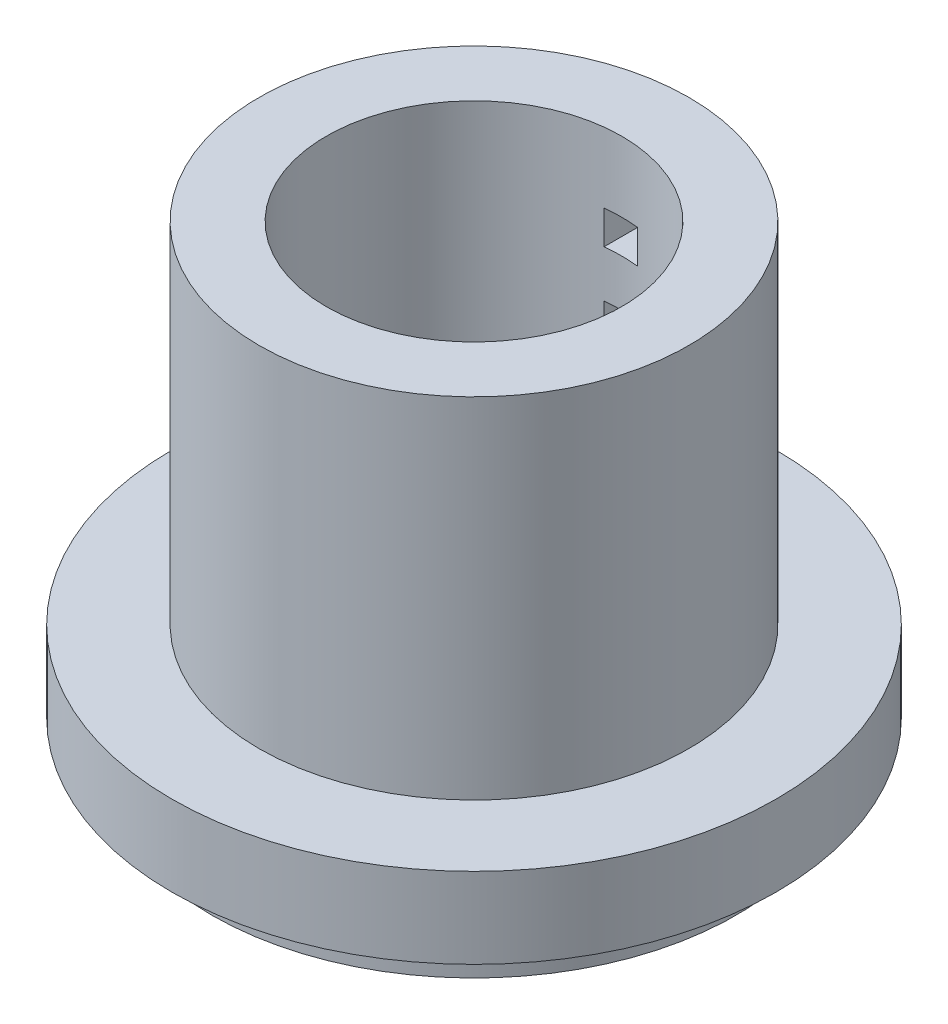
ISO-10303-21;
HEADER;
FILE_DESCRIPTION(('STEP AP214'),'2;1');
FILE_NAME('part.step','',(''),(''),'','','');
FILE_SCHEMA(('AUTOMOTIVE_DESIGN { 1 0 10303 214 1 1 1 1 }'));
ENDSEC;
DATA;
#1=APPLICATION_CONTEXT('core data for automotive mechanical design processes');
#2=APPLICATION_PROTOCOL_DEFINITION('international standard','automotive_design',2000,#1);
#3=PRODUCT_CONTEXT('',#1,'mechanical');
#4=PRODUCT('Part','Part','',(#3));
#5=PRODUCT_RELATED_PRODUCT_CATEGORY('part','',(#4));
#6=PRODUCT_DEFINITION_FORMATION('','',#4);
#7=PRODUCT_DEFINITION_CONTEXT('part definition',#1,'design');
#8=PRODUCT_DEFINITION('design','',#6,#7);
#9=PRODUCT_DEFINITION_SHAPE('','',#8);
#10=(LENGTH_UNIT() NAMED_UNIT(*) SI_UNIT(.MILLI.,.METRE.));
#11=(NAMED_UNIT(*) PLANE_ANGLE_UNIT() SI_UNIT($,.RADIAN.));
#12=(NAMED_UNIT(*) SI_UNIT($,.STERADIAN.) SOLID_ANGLE_UNIT());
#13=UNCERTAINTY_MEASURE_WITH_UNIT(LENGTH_MEASURE(1.E-05),#10,'distance_accuracy_value','');
#14=(GEOMETRIC_REPRESENTATION_CONTEXT(3) GLOBAL_UNCERTAINTY_ASSIGNED_CONTEXT((#13)) GLOBAL_UNIT_ASSIGNED_CONTEXT((#10,
#11,#12)) REPRESENTATION_CONTEXT('',''));
#15=CARTESIAN_POINT('',(0.,0.,0.));
#16=DIRECTION('',(0.,0.,1.));
#17=DIRECTION('',(1.,0.,0.));
#18=AXIS2_PLACEMENT_3D('',#15,#16,#17);
#19=CARTESIAN_POINT('',(0.,28.8051931619806,0.));
#20=DIRECTION('',(0.,1.,0.));
#21=DIRECTION('',(0.,0.,1.));
#22=AXIS2_PLACEMENT_3D('',#19,#20,#21);
#23=CYLINDRICAL_SURFACE('',#22,17.5);
#24=CARTESIAN_POINT('',(0.,-3.,0.));
#25=DIRECTION('',(0.,1.,0.));
#26=DIRECTION('',(0.,0.,1.));
#27=AXIS2_PLACEMENT_3D('',#24,#25,#26);
#28=CIRCLE('',#27,17.5);
#29=CARTESIAN_POINT('',(0.,-3.,17.5));
#30=VERTEX_POINT('',#29);
#31=EDGE_CURVE('E270',#30,#30,#28,.T.);
#32=ORIENTED_EDGE('',*,*,#31,.F.);
#33=EDGE_LOOP('',(#32));
#34=FACE_BOUND('',#33,.T.);
#35=CARTESIAN_POINT('',(0.,0.,0.));
#36=DIRECTION('',(0.,1.,0.));
#37=DIRECTION('',(0.,0.,1.));
#38=AXIS2_PLACEMENT_3D('',#35,#36,#37);
#39=CIRCLE('',#38,17.5);
#40=CARTESIAN_POINT('',(0.,0.,17.5));
#41=VERTEX_POINT('',#40);
#42=EDGE_CURVE('E234',#41,#41,#39,.T.);
#43=ORIENTED_EDGE('',*,*,#42,.T.);
#44=EDGE_LOOP('',(#43));
#45=FACE_BOUND('',#44,.T.);
#46=ADVANCED_FACE('F39',(#34,#45),#23,.F.);
#47=CARTESIAN_POINT('',(17.5,-3.,0.));
#48=DIRECTION('',(0.,1.,0.));
#49=DIRECTION('',(0.,0.,1.));
#50=AXIS2_PLACEMENT_3D('',#47,#48,#49);
#51=PLANE('',#50);
#52=CARTESIAN_POINT('',(0.,-3.,0.));
#53=DIRECTION('',(0.,1.,0.));
#54=DIRECTION('',(0.,0.,1.));
#55=AXIS2_PLACEMENT_3D('',#52,#53,#54);
#56=CIRCLE('',#55,19.5);
#57=CARTESIAN_POINT('',(0.,-3.,19.5));
#58=VERTEX_POINT('',#57);
#59=EDGE_CURVE('E266',#58,#58,#56,.T.);
#60=ORIENTED_EDGE('',*,*,#59,.F.);
#61=EDGE_LOOP('',(#60));
#62=FACE_BOUND('',#61,.T.);
#63=ORIENTED_EDGE('',*,*,#31,.T.);
#64=EDGE_LOOP('',(#63));
#65=FACE_BOUND('',#64,.T.);
#66=ADVANCED_FACE('F435',(#62,#65),#51,.F.);
#67=CARTESIAN_POINT('',(0.,28.8051931619806,0.));
#68=DIRECTION('',(0.,1.,0.));
#69=DIRECTION('',(0.,0.,1.));
#70=AXIS2_PLACEMENT_3D('',#67,#68,#69);
#71=CYLINDRICAL_SURFACE('',#70,19.5);
#72=CARTESIAN_POINT('',(0.,0.,0.));
#73=DIRECTION('',(0.,1.,0.));
#74=DIRECTION('',(0.,0.,1.));
#75=AXIS2_PLACEMENT_3D('',#72,#73,#74);
#76=CIRCLE('',#75,19.5);
#77=CARTESIAN_POINT('',(0.,0.,19.5));
#78=VERTEX_POINT('',#77);
#79=EDGE_CURVE('E262',#78,#78,#76,.T.);
#80=ORIENTED_EDGE('',*,*,#79,.F.);
#81=EDGE_LOOP('',(#80));
#82=FACE_BOUND('',#81,.T.);
#83=ORIENTED_EDGE('',*,*,#59,.T.);
#84=EDGE_LOOP('',(#83));
#85=FACE_BOUND('',#84,.T.);
#86=ADVANCED_FACE('F429',(#82,#85),#71,.T.);
#87=CARTESIAN_POINT('',(19.5,0.,0.));
#88=DIRECTION('',(0.,1.,0.));
#89=DIRECTION('',(0.,0.,1.));
#90=AXIS2_PLACEMENT_3D('',#87,#88,#89);
#91=PLANE('',#90);
#92=CARTESIAN_POINT('',(0.,0.,0.));
#93=DIRECTION('',(0.,1.,0.));
#94=DIRECTION('',(0.,0.,1.));
#95=AXIS2_PLACEMENT_3D('',#92,#93,#94);
#96=CIRCLE('',#95,22.5);
#97=CARTESIAN_POINT('',(0.,0.,22.5));
#98=VERTEX_POINT('',#97);
#99=EDGE_CURVE('E258',#98,#98,#96,.T.);
#100=ORIENTED_EDGE('',*,*,#99,.F.);
#101=EDGE_LOOP('',(#100));
#102=FACE_BOUND('',#101,.T.);
#103=ORIENTED_EDGE('',*,*,#79,.T.);
#104=EDGE_LOOP('',(#103));
#105=FACE_BOUND('',#104,.T.);
#106=ADVANCED_FACE('F423',(#102,#105),#91,.F.);
#107=CARTESIAN_POINT('',(0.,28.8051931619806,0.));
#108=DIRECTION('',(0.,1.,0.));
#109=DIRECTION('',(0.,0.,1.));
#110=AXIS2_PLACEMENT_3D('',#107,#108,#109);
#111=CYLINDRICAL_SURFACE('',#110,22.5);
#112=CARTESIAN_POINT('',(0.,6.,0.));
#113=DIRECTION('',(0.,1.,0.));
#114=DIRECTION('',(0.,0.,1.));
#115=AXIS2_PLACEMENT_3D('',#112,#113,#114);
#116=CIRCLE('',#115,22.5);
#117=CARTESIAN_POINT('',(0.,6.,22.5));
#118=VERTEX_POINT('',#117);
#119=EDGE_CURVE('E254',#118,#118,#116,.T.);
#120=ORIENTED_EDGE('',*,*,#119,.F.);
#121=EDGE_LOOP('',(#120));
#122=FACE_BOUND('',#121,.T.);
#123=ORIENTED_EDGE('',*,*,#99,.T.);
#124=EDGE_LOOP('',(#123));
#125=FACE_BOUND('',#124,.T.);
#126=ADVANCED_FACE('F417',(#122,#125),#111,.T.);
#127=CARTESIAN_POINT('',(22.5,6.,0.));
#128=DIRECTION('',(0.,-1.,0.));
#129=DIRECTION('',(0.,0.,-1.));
#130=AXIS2_PLACEMENT_3D('',#127,#128,#129);
#131=PLANE('',#130);
#132=CARTESIAN_POINT('',(0.,6.,0.));
#133=DIRECTION('',(0.,1.,0.));
#134=DIRECTION('',(0.,0.,1.));
#135=AXIS2_PLACEMENT_3D('',#132,#133,#134);
#136=CIRCLE('',#135,16.);
#137=CARTESIAN_POINT('',(0.,6.,16.));
#138=VERTEX_POINT('',#137);
#139=EDGE_CURVE('E250',#138,#138,#136,.T.);
#140=ORIENTED_EDGE('',*,*,#139,.F.);
#141=EDGE_LOOP('',(#140));
#142=FACE_BOUND('',#141,.T.);
#143=ORIENTED_EDGE('',*,*,#119,.T.);
#144=EDGE_LOOP('',(#143));
#145=FACE_BOUND('',#144,.T.);
#146=ADVANCED_FACE('F410',(#142,#145),#131,.F.);
#147=CARTESIAN_POINT('',(0.,28.8051931619806,0.));
#148=DIRECTION('',(0.,1.,0.));
#149=DIRECTION('',(0.,0.,1.));
#150=AXIS2_PLACEMENT_3D('',#147,#148,#149);
#151=CYLINDRICAL_SURFACE('',#150,16.);
#152=CARTESIAN_POINT('',(0.,6.27241321520608,0.));
#153=DIRECTION('',(0.,-1.,0.));
#154=DIRECTION('',(1.,0.,0.));
#155=AXIS2_PLACEMENT_3D('',#152,#153,#154);
#156=CIRCLE('',#155,16.);
#157=CARTESIAN_POINT('',(-1.25,6.27241321520608,-15.9510971409493));
#158=VERTEX_POINT('',#157);
#159=CARTESIAN_POINT('',(1.25,6.27241321520608,-15.9510971409493));
#160=VERTEX_POINT('',#159);
#161=EDGE_CURVE('E226',#158,#160,#156,.T.);
#162=ORIENTED_EDGE('',*,*,#161,.T.);
#163=DIRECTION('',(0.,1.,0.));
#164=VECTOR('',#163,1.);
#165=CARTESIAN_POINT('',(1.24999999999999,28.8051931619806,-15.9510971409493));
#166=LINE('',#165,#164);
#167=CARTESIAN_POINT('',(1.25,8.77241321520608,-15.9510971409493));
#168=VERTEX_POINT('',#167);
#169=EDGE_CURVE('E230',#160,#168,#166,.T.);
#170=ORIENTED_EDGE('',*,*,#169,.T.);
#171=CARTESIAN_POINT('',(0.,8.77241321520608,0.));
#172=DIRECTION('',(0.,1.,0.));
#173=DIRECTION('',(-1.,0.,0.));
#174=AXIS2_PLACEMENT_3D('',#171,#172,#173);
#175=CIRCLE('',#174,16.);
#176=CARTESIAN_POINT('',(-1.25,8.77241321520608,-15.9510971409493));
#177=VERTEX_POINT('',#176);
#178=EDGE_CURVE('E218',#168,#177,#175,.T.);
#179=ORIENTED_EDGE('',*,*,#178,.T.);
#180=DIRECTION('',(0.,1.,0.));
#181=VECTOR('',#180,1.);
#182=CARTESIAN_POINT('',(-1.25,28.8051931619806,-15.9510971409493));
#183=LINE('',#182,#181);
#184=EDGE_CURVE('E222',#177,#158,#183,.F.);
#185=ORIENTED_EDGE('',*,*,#184,.T.);
#186=EDGE_LOOP('',(#162,#170,#179,#185));
#187=FACE_BOUND('',#186,.T.);
#188=CARTESIAN_POINT('',(0.,12.2724132152061,0.));
#189=DIRECTION('',(0.,-1.,0.));
#190=DIRECTION('',(0.,0.,-1.));
#191=AXIS2_PLACEMENT_3D('',#188,#189,#190);
#192=CIRCLE('',#191,16.);
#193=CARTESIAN_POINT('',(-1.25000000000002,12.2724132152061,-15.9510971409493));
#194=VERTEX_POINT('',#193);
#195=CARTESIAN_POINT('',(1.24999999999998,12.2724132152061,-15.9510971409493));
#196=VERTEX_POINT('',#195);
#197=EDGE_CURVE('E210',#194,#196,#192,.T.);
#198=ORIENTED_EDGE('',*,*,#197,.T.);
#199=DIRECTION('',(0.,1.,0.));
#200=VECTOR('',#199,1.);
#201=CARTESIAN_POINT('',(1.24999999999998,28.8051931619806,-15.9510971409493));
#202=LINE('',#201,#200);
#203=CARTESIAN_POINT('',(1.24999999999998,14.7724132152061,-15.9510971409493));
#204=VERTEX_POINT('',#203);
#205=EDGE_CURVE('E214',#196,#204,#202,.T.);
#206=ORIENTED_EDGE('',*,*,#205,.T.);
#207=CARTESIAN_POINT('',(0.,14.7724132152061,0.));
#208=DIRECTION('',(0.,1.,0.));
#209=DIRECTION('',(-1.,0.,0.));
#210=AXIS2_PLACEMENT_3D('',#207,#208,#209);
#211=CIRCLE('',#210,16.);
#212=CARTESIAN_POINT('',(-1.25000000000002,14.7724132152061,-15.9510971409493));
#213=VERTEX_POINT('',#212);
#214=EDGE_CURVE('E202',#204,#213,#211,.T.);
#215=ORIENTED_EDGE('',*,*,#214,.T.);
#216=DIRECTION('',(0.,1.,0.));
#217=VECTOR('',#216,1.);
#218=CARTESIAN_POINT('',(-1.25000000000002,28.8051931619806,-15.9510971409493));
#219=LINE('',#218,#217);
#220=EDGE_CURVE('E206',#213,#194,#219,.F.);
#221=ORIENTED_EDGE('',*,*,#220,.T.);
#222=EDGE_LOOP('',(#198,#206,#215,#221));
#223=FACE_BOUND('',#222,.T.);
#224=CARTESIAN_POINT('',(0.,18.2724132152061,0.));
#225=DIRECTION('',(0.,-1.,0.));
#226=DIRECTION('',(1.,0.,0.));
#227=AXIS2_PLACEMENT_3D('',#224,#225,#226);
#228=CIRCLE('',#227,16.);
#229=CARTESIAN_POINT('',(-1.25000000000004,18.2724132152061,-15.9510971409493));
#230=VERTEX_POINT('',#229);
#231=CARTESIAN_POINT('',(1.24999999999996,18.2724132152061,-15.9510971409493));
#232=VERTEX_POINT('',#231);
#233=EDGE_CURVE('E194',#230,#232,#228,.T.);
#234=ORIENTED_EDGE('',*,*,#233,.T.);
#235=DIRECTION('',(0.,1.,0.));
#236=VECTOR('',#235,1.);
#237=CARTESIAN_POINT('',(1.24999999999996,28.8051931619806,-15.9510971409493));
#238=LINE('',#237,#236);
#239=CARTESIAN_POINT('',(1.24999999999996,20.7724132152061,-15.9510971409493));
#240=VERTEX_POINT('',#239);
#241=EDGE_CURVE('E198',#232,#240,#238,.T.);
#242=ORIENTED_EDGE('',*,*,#241,.T.);
#243=CARTESIAN_POINT('',(0.,20.7724132152061,0.));
#244=DIRECTION('',(0.,1.,0.));
#245=DIRECTION('',(0.,0.,1.));
#246=AXIS2_PLACEMENT_3D('',#243,#244,#245);
#247=CIRCLE('',#246,16.);
#248=CARTESIAN_POINT('',(-1.25000000000004,20.7724132152061,-15.9510971409493));
#249=VERTEX_POINT('',#248);
#250=EDGE_CURVE('E181',#240,#249,#247,.T.);
#251=ORIENTED_EDGE('',*,*,#250,.T.);
#252=DIRECTION('',(0.,1.,0.));
#253=VECTOR('',#252,1.);
#254=CARTESIAN_POINT('',(-1.25000000000004,28.8051931619806,-15.9510971409493));
#255=LINE('',#254,#253);
#256=EDGE_CURVE('E186',#249,#230,#255,.F.);
#257=ORIENTED_EDGE('',*,*,#256,.T.);
#258=EDGE_LOOP('',(#234,#242,#251,#257));
#259=FACE_BOUND('',#258,.T.);
#260=CARTESIAN_POINT('',(0.,24.2724132152061,0.));
#261=DIRECTION('',(0.,-1.,0.));
#262=DIRECTION('',(0.,0.,-1.));
#263=AXIS2_PLACEMENT_3D('',#260,#261,#262);
#264=CIRCLE('',#263,16.);
#265=CARTESIAN_POINT('',(-1.25000000000006,24.2724132152061,-15.9510971409493));
#266=VERTEX_POINT('',#265);
#267=CARTESIAN_POINT('',(1.24999999999994,24.2724132152061,-15.9510971409493));
#268=VERTEX_POINT('',#267);
#269=EDGE_CURVE('E179',#266,#268,#264,.T.);
#270=ORIENTED_EDGE('',*,*,#269,.T.);
#271=DIRECTION('',(0.,1.,0.));
#272=VECTOR('',#271,1.);
#273=CARTESIAN_POINT('',(1.24999999999994,28.8051931619806,-15.9510971409493));
#274=LINE('',#273,#272);
#275=CARTESIAN_POINT('',(1.24999999999994,26.7724132152061,-15.9510971409493));
#276=VERTEX_POINT('',#275);
#277=EDGE_CURVE('E169',#268,#276,#274,.T.);
#278=ORIENTED_EDGE('',*,*,#277,.T.);
#279=CARTESIAN_POINT('',(0.,26.7724132152061,0.));
#280=DIRECTION('',(0.,1.,0.));
#281=DIRECTION('',(-1.,0.,0.));
#282=AXIS2_PLACEMENT_3D('',#279,#280,#281);
#283=CIRCLE('',#282,16.);
#284=CARTESIAN_POINT('',(-1.25000000000006,26.7724132152061,-15.9510971409493));
#285=VERTEX_POINT('',#284);
#286=EDGE_CURVE('E151',#276,#285,#283,.T.);
#287=ORIENTED_EDGE('',*,*,#286,.T.);
#288=DIRECTION('',(0.,1.,0.));
#289=VECTOR('',#288,1.);
#290=CARTESIAN_POINT('',(-1.25000000000006,28.8051931619806,-15.9510971409493));
#291=LINE('',#290,#289);
#292=EDGE_CURVE('E163',#285,#266,#291,.F.);
#293=ORIENTED_EDGE('',*,*,#292,.T.);
#294=EDGE_LOOP('',(#270,#278,#287,#293));
#295=FACE_BOUND('',#294,.T.);
#296=CARTESIAN_POINT('',(0.,32.,0.));
#297=DIRECTION('',(0.,1.,0.));
#298=DIRECTION('',(0.,0.,1.));
#299=AXIS2_PLACEMENT_3D('',#296,#297,#298);
#300=CIRCLE('',#299,16.);
#301=CARTESIAN_POINT('',(0.,32.,16.));
#302=VERTEX_POINT('',#301);
#303=EDGE_CURVE('E246',#302,#302,#300,.T.);
#304=ORIENTED_EDGE('',*,*,#303,.F.);
#305=EDGE_LOOP('',(#304));
#306=FACE_BOUND('',#305,.T.);
#307=ORIENTED_EDGE('',*,*,#139,.T.);
#308=EDGE_LOOP('',(#307));
#309=FACE_BOUND('',#308,.T.);
#310=ADVANCED_FACE('F177',(#187,#223,#259,#295,#306,#309),#151,.T.);
#311=CARTESIAN_POINT('',(16.,32.,0.));
#312=DIRECTION('',(0.,-1.,0.));
#313=DIRECTION('',(0.,0.,-1.));
#314=AXIS2_PLACEMENT_3D('',#311,#312,#313);
#315=PLANE('',#314);
#316=CARTESIAN_POINT('',(0.,32.,0.));
#317=DIRECTION('',(0.,1.,0.));
#318=DIRECTION('',(0.,0.,1.));
#319=AXIS2_PLACEMENT_3D('',#316,#317,#318);
#320=CIRCLE('',#319,11.);
#321=CARTESIAN_POINT('',(0.,32.,11.));
#322=VERTEX_POINT('',#321);
#323=EDGE_CURVE('E242',#322,#322,#320,.T.);
#324=ORIENTED_EDGE('',*,*,#323,.F.);
#325=EDGE_LOOP('',(#324));
#326=FACE_BOUND('',#325,.T.);
#327=ORIENTED_EDGE('',*,*,#303,.T.);
#328=EDGE_LOOP('',(#327));
#329=FACE_BOUND('',#328,.T.);
#330=ADVANCED_FACE('F398',(#326,#329),#315,.F.);
#331=CARTESIAN_POINT('',(0.,28.8051931619806,0.));
#332=DIRECTION('',(0.,1.,0.));
#333=DIRECTION('',(0.,0.,1.));
#334=AXIS2_PLACEMENT_3D('',#331,#332,#333);
#335=CYLINDRICAL_SURFACE('',#334,11.);
#336=CARTESIAN_POINT('',(0.,8.77241321520608,0.));
#337=DIRECTION('',(0.,1.,0.));
#338=DIRECTION('',(-1.,0.,0.));
#339=AXIS2_PLACEMENT_3D('',#336,#337,#338);
#340=CIRCLE('',#339,11.);
#341=CARTESIAN_POINT('',(-1.25,8.77241321520608,-10.9287464971972));
#342=VERTEX_POINT('',#341);
#343=CARTESIAN_POINT('',(1.25,8.77241321520608,-10.9287464971972));
#344=VERTEX_POINT('',#343);
#345=EDGE_CURVE('E319',#342,#344,#340,.F.);
#346=ORIENTED_EDGE('',*,*,#345,.T.);
#347=DIRECTION('',(0.,1.,0.));
#348=VECTOR('',#347,1.);
#349=CARTESIAN_POINT('',(1.24999999999999,28.8051931619806,-10.9287464971972));
#350=LINE('',#349,#348);
#351=CARTESIAN_POINT('',(1.25,6.27241321520608,-10.9287464971972));
#352=VERTEX_POINT('',#351);
#353=EDGE_CURVE('E11',#344,#352,#350,.F.);
#354=ORIENTED_EDGE('',*,*,#353,.T.);
#355=CARTESIAN_POINT('',(0.,6.27241321520608,0.));
#356=DIRECTION('',(0.,-1.,0.));
#357=DIRECTION('',(1.,0.,0.));
#358=AXIS2_PLACEMENT_3D('',#355,#356,#357);
#359=CIRCLE('',#358,11.);
#360=CARTESIAN_POINT('',(-1.25,6.27241321520608,-10.9287464971972));
#361=VERTEX_POINT('',#360);
#362=EDGE_CURVE('E47',#352,#361,#359,.F.);
#363=ORIENTED_EDGE('',*,*,#362,.T.);
#364=DIRECTION('',(0.,1.,0.));
#365=VECTOR('',#364,1.);
#366=CARTESIAN_POINT('',(-1.25,28.8051931619806,-10.9287464971972));
#367=LINE('',#366,#365);
#368=EDGE_CURVE('E323',#361,#342,#367,.T.);
#369=ORIENTED_EDGE('',*,*,#368,.T.);
#370=EDGE_LOOP('',(#346,#354,#363,#369));
#371=FACE_BOUND('',#370,.T.);
#372=CARTESIAN_POINT('',(0.,14.7724132152061,0.));
#373=DIRECTION('',(0.,1.,0.));
#374=DIRECTION('',(-1.,0.,0.));
#375=AXIS2_PLACEMENT_3D('',#372,#373,#374);
#376=CIRCLE('',#375,11.);
#377=CARTESIAN_POINT('',(-1.25000000000002,14.7724132152061,-10.9287464971972));
#378=VERTEX_POINT('',#377);
#379=CARTESIAN_POINT('',(1.24999999999998,14.7724132152061,-10.9287464971972));
#380=VERTEX_POINT('',#379);
#381=EDGE_CURVE('E303',#378,#380,#376,.F.);
#382=ORIENTED_EDGE('',*,*,#381,.T.);
#383=DIRECTION('',(0.,1.,0.));
#384=VECTOR('',#383,1.);
#385=CARTESIAN_POINT('',(1.24999999999998,28.8051931619806,-10.9287464971972));
#386=LINE('',#385,#384);
#387=CARTESIAN_POINT('',(1.24999999999998,12.2724132152061,-10.9287464971972));
#388=VERTEX_POINT('',#387);
#389=EDGE_CURVE('E315',#380,#388,#386,.F.);
#390=ORIENTED_EDGE('',*,*,#389,.T.);
#391=CARTESIAN_POINT('',(0.,12.2724132152061,0.));
#392=DIRECTION('',(0.,-1.,0.));
#393=DIRECTION('',(0.,0.,-1.));
#394=AXIS2_PLACEMENT_3D('',#391,#392,#393);
#395=CIRCLE('',#394,11.);
#396=CARTESIAN_POINT('',(-1.25000000000002,12.2724132152061,-10.9287464971972));
#397=VERTEX_POINT('',#396);
#398=EDGE_CURVE('E311',#388,#397,#395,.F.);
#399=ORIENTED_EDGE('',*,*,#398,.T.);
#400=DIRECTION('',(0.,1.,0.));
#401=VECTOR('',#400,1.);
#402=CARTESIAN_POINT('',(-1.25000000000002,28.8051931619806,-10.9287464971972));
#403=LINE('',#402,#401);
#404=EDGE_CURVE('E307',#397,#378,#403,.T.);
#405=ORIENTED_EDGE('',*,*,#404,.T.);
#406=EDGE_LOOP('',(#382,#390,#399,#405));
#407=FACE_BOUND('',#406,.T.);
#408=CARTESIAN_POINT('',(0.,20.7724132152061,0.));
#409=DIRECTION('',(0.,1.,0.));
#410=DIRECTION('',(0.,0.,1.));
#411=AXIS2_PLACEMENT_3D('',#408,#409,#410);
#412=CIRCLE('',#411,11.);
#413=CARTESIAN_POINT('',(-1.25000000000004,20.7724132152061,-10.9287464971972));
#414=VERTEX_POINT('',#413);
#415=CARTESIAN_POINT('',(1.24999999999996,20.7724132152061,-10.9287464971972));
#416=VERTEX_POINT('',#415);
#417=EDGE_CURVE('E287',#414,#416,#412,.F.);
#418=ORIENTED_EDGE('',*,*,#417,.T.);
#419=DIRECTION('',(0.,1.,0.));
#420=VECTOR('',#419,1.);
#421=CARTESIAN_POINT('',(1.24999999999996,28.8051931619806,-10.9287464971972));
#422=LINE('',#421,#420);
#423=CARTESIAN_POINT('',(1.24999999999996,18.2724132152061,-10.9287464971972));
#424=VERTEX_POINT('',#423);
#425=EDGE_CURVE('E299',#416,#424,#422,.F.);
#426=ORIENTED_EDGE('',*,*,#425,.T.);
#427=CARTESIAN_POINT('',(0.,18.2724132152061,0.));
#428=DIRECTION('',(0.,-1.,0.));
#429=DIRECTION('',(1.,0.,0.));
#430=AXIS2_PLACEMENT_3D('',#427,#428,#429);
#431=CIRCLE('',#430,11.);
#432=CARTESIAN_POINT('',(-1.25000000000004,18.2724132152061,-10.9287464971972));
#433=VERTEX_POINT('',#432);
#434=EDGE_CURVE('E295',#424,#433,#431,.F.);
#435=ORIENTED_EDGE('',*,*,#434,.T.);
#436=DIRECTION('',(0.,1.,0.));
#437=VECTOR('',#436,1.);
#438=CARTESIAN_POINT('',(-1.25000000000004,28.8051931619806,-10.9287464971972));
#439=LINE('',#438,#437);
#440=EDGE_CURVE('E291',#433,#414,#439,.T.);
#441=ORIENTED_EDGE('',*,*,#440,.T.);
#442=EDGE_LOOP('',(#418,#426,#435,#441));
#443=FACE_BOUND('',#442,.T.);
#444=CARTESIAN_POINT('',(0.,26.7724132152061,0.));
#445=DIRECTION('',(0.,1.,0.));
#446=DIRECTION('',(-1.,0.,0.));
#447=AXIS2_PLACEMENT_3D('',#444,#445,#446);
#448=CIRCLE('',#447,11.);
#449=CARTESIAN_POINT('',(-1.25000000000006,26.7724132152061,-10.9287464971972));
#450=VERTEX_POINT('',#449);
#451=CARTESIAN_POINT('',(1.24999999999994,26.7724132152061,-10.9287464971972));
#452=VERTEX_POINT('',#451);
#453=EDGE_CURVE('E274',#450,#452,#448,.F.);
#454=ORIENTED_EDGE('',*,*,#453,.T.);
#455=DIRECTION('',(0.,1.,0.));
#456=VECTOR('',#455,1.);
#457=CARTESIAN_POINT('',(1.24999999999994,28.8051931619806,-10.9287464971972));
#458=LINE('',#457,#456);
#459=CARTESIAN_POINT('',(1.24999999999994,24.2724132152061,-10.9287464971972));
#460=VERTEX_POINT('',#459);
#461=EDGE_CURVE('E172',#452,#460,#458,.F.);
#462=ORIENTED_EDGE('',*,*,#461,.T.);
#463=CARTESIAN_POINT('',(0.,24.2724132152061,0.));
#464=DIRECTION('',(0.,-1.,0.));
#465=DIRECTION('',(0.,0.,-1.));
#466=AXIS2_PLACEMENT_3D('',#463,#464,#465);
#467=CIRCLE('',#466,11.);
#468=CARTESIAN_POINT('',(-1.25000000000006,24.2724132152061,-10.9287464971972));
#469=VERTEX_POINT('',#468);
#470=EDGE_CURVE('E281',#460,#469,#467,.F.);
#471=ORIENTED_EDGE('',*,*,#470,.T.);
#472=DIRECTION('',(0.,1.,0.));
#473=VECTOR('',#472,1.);
#474=CARTESIAN_POINT('',(-1.25000000000006,28.8051931619806,-10.9287464971972));
#475=LINE('',#474,#473);
#476=EDGE_CURVE('E277',#469,#450,#475,.T.);
#477=ORIENTED_EDGE('',*,*,#476,.T.);
#478=EDGE_LOOP('',(#454,#462,#471,#477));
#479=FACE_BOUND('',#478,.T.);
#480=CARTESIAN_POINT('',(0.,0.,0.));
#481=DIRECTION('',(0.,1.,0.));
#482=DIRECTION('',(0.,0.,1.));
#483=AXIS2_PLACEMENT_3D('',#480,#481,#482);
#484=CIRCLE('',#483,11.);
#485=CARTESIAN_POINT('',(0.,0.,11.));
#486=VERTEX_POINT('',#485);
#487=EDGE_CURVE('E238',#486,#486,#484,.T.);
#488=ORIENTED_EDGE('',*,*,#487,.F.);
#489=EDGE_LOOP('',(#488));
#490=FACE_BOUND('',#489,.T.);
#491=ORIENTED_EDGE('',*,*,#323,.T.);
#492=EDGE_LOOP('',(#491));
#493=FACE_BOUND('',#492,.T.);
#494=ADVANCED_FACE('F329',(#371,#407,#443,#479,#490,#493),#335,.F.);
#495=CARTESIAN_POINT('',(11.,0.,0.));
#496=DIRECTION('',(0.,1.,0.));
#497=DIRECTION('',(0.,0.,1.));
#498=AXIS2_PLACEMENT_3D('',#495,#496,#497);
#499=PLANE('',#498);
#500=ORIENTED_EDGE('',*,*,#42,.F.);
#501=EDGE_LOOP('',(#500));
#502=FACE_BOUND('',#501,.T.);
#503=ORIENTED_EDGE('',*,*,#487,.T.);
#504=EDGE_LOOP('',(#503));
#505=FACE_BOUND('',#504,.T.);
#506=ADVANCED_FACE('F397',(#502,#505),#499,.F.);
#507=CARTESIAN_POINT('',(1.24999999999994,26.7724132152061,-20.));
#508=DIRECTION('',(1.,0.,0.));
#509=DIRECTION('',(0.,1.,0.));
#510=AXIS2_PLACEMENT_3D('',#507,#508,#509);
#511=PLANE('',#510);
#512=DIRECTION('',(0.,0.,1.));
#513=VECTOR('',#512,1.);
#514=CARTESIAN_POINT('',(1.24999999999994,24.2724132152061,-20.));
#515=LINE('',#514,#513);
#516=EDGE_CURVE('E380',#268,#460,#515,.T.);
#517=ORIENTED_EDGE('',*,*,#516,.T.);
#518=ORIENTED_EDGE('',*,*,#461,.F.);
#519=DIRECTION('',(0.,0.,1.));
#520=VECTOR('',#519,1.);
#521=CARTESIAN_POINT('',(1.24999999999994,26.7724132152061,-20.));
#522=LINE('',#521,#520);
#523=EDGE_CURVE('E154',#276,#452,#522,.T.);
#524=ORIENTED_EDGE('',*,*,#523,.F.);
#525=ORIENTED_EDGE('',*,*,#277,.F.);
#526=EDGE_LOOP('',(#517,#518,#524,#525));
#527=FACE_BOUND('',#526,.T.);
#528=ADVANCED_FACE('F168',(#527),#511,.F.);
#529=CARTESIAN_POINT('',(-1.25000000000006,24.2724132152061,-20.));
#530=DIRECTION('',(0.,-1.,0.));
#531=DIRECTION('',(0.,0.,-1.));
#532=AXIS2_PLACEMENT_3D('',#529,#530,#531);
#533=PLANE('',#532);
#534=DIRECTION('',(0.,0.,1.));
#535=VECTOR('',#534,1.);
#536=CARTESIAN_POINT('',(-1.25000000000006,24.2724132152061,-20.));
#537=LINE('',#536,#535);
#538=EDGE_CURVE('E383',#266,#469,#537,.T.);
#539=ORIENTED_EDGE('',*,*,#538,.T.);
#540=ORIENTED_EDGE('',*,*,#470,.F.);
#541=ORIENTED_EDGE('',*,*,#516,.F.);
#542=ORIENTED_EDGE('',*,*,#269,.F.);
#543=EDGE_LOOP('',(#539,#540,#541,#542));
#544=FACE_BOUND('',#543,.T.);
#545=ADVANCED_FACE('F393',(#544),#533,.F.);
#546=CARTESIAN_POINT('',(-1.25000000000006,26.7724132152061,-20.));
#547=DIRECTION('',(-1.,0.,0.));
#548=DIRECTION('',(0.,0.,1.));
#549=AXIS2_PLACEMENT_3D('',#546,#547,#548);
#550=PLANE('',#549);
#551=DIRECTION('',(0.,0.,1.));
#552=VECTOR('',#551,1.);
#553=CARTESIAN_POINT('',(-1.25000000000006,26.7724132152061,-20.));
#554=LINE('',#553,#552);
#555=EDGE_CURVE('E157',#285,#450,#554,.T.);
#556=ORIENTED_EDGE('',*,*,#555,.T.);
#557=ORIENTED_EDGE('',*,*,#476,.F.);
#558=ORIENTED_EDGE('',*,*,#538,.F.);
#559=ORIENTED_EDGE('',*,*,#292,.F.);
#560=EDGE_LOOP('',(#556,#557,#558,#559));
#561=FACE_BOUND('',#560,.T.);
#562=ADVANCED_FACE('F391',(#561),#550,.F.);
#563=CARTESIAN_POINT('',(-1.25000000000006,26.7724132152061,-20.));
#564=DIRECTION('',(0.,1.,0.));
#565=DIRECTION('',(-1.,0.,0.));
#566=AXIS2_PLACEMENT_3D('',#563,#564,#565);
#567=PLANE('',#566);
#568=ORIENTED_EDGE('',*,*,#523,.T.);
#569=ORIENTED_EDGE('',*,*,#453,.F.);
#570=ORIENTED_EDGE('',*,*,#555,.F.);
#571=ORIENTED_EDGE('',*,*,#286,.F.);
#572=EDGE_LOOP('',(#568,#569,#570,#571));
#573=FACE_BOUND('',#572,.T.);
#574=ADVANCED_FACE('F153',(#573),#567,.F.);
#575=CARTESIAN_POINT('',(1.24999999999996,20.7724132152061,-20.));
#576=DIRECTION('',(1.,0.,0.));
#577=DIRECTION('',(0.,1.,0.));
#578=AXIS2_PLACEMENT_3D('',#575,#576,#577);
#579=PLANE('',#578);
#580=DIRECTION('',(0.,0.,1.));
#581=VECTOR('',#580,1.);
#582=CARTESIAN_POINT('',(1.24999999999996,18.2724132152061,-20.));
#583=LINE('',#582,#581);
#584=EDGE_CURVE('E365',#232,#424,#583,.T.);
#585=ORIENTED_EDGE('',*,*,#584,.T.);
#586=ORIENTED_EDGE('',*,*,#425,.F.);
#587=DIRECTION('',(0.,0.,1.));
#588=VECTOR('',#587,1.);
#589=CARTESIAN_POINT('',(1.24999999999996,20.7724132152061,-20.));
#590=LINE('',#589,#588);
#591=EDGE_CURVE('E377',#240,#416,#590,.T.);
#592=ORIENTED_EDGE('',*,*,#591,.F.);
#593=ORIENTED_EDGE('',*,*,#241,.F.);
#594=EDGE_LOOP('',(#585,#586,#592,#593));
#595=FACE_BOUND('',#594,.T.);
#596=ADVANCED_FACE('F457',(#595),#579,.F.);
#597=CARTESIAN_POINT('',(-1.25000000000004,18.2724132152061,-20.));
#598=DIRECTION('',(0.,-1.,0.));
#599=DIRECTION('',(1.,0.,0.));
#600=AXIS2_PLACEMENT_3D('',#597,#598,#599);
#601=PLANE('',#600);
#602=DIRECTION('',(0.,0.,1.));
#603=VECTOR('',#602,1.);
#604=CARTESIAN_POINT('',(-1.25000000000004,18.2724132152061,-20.));
#605=LINE('',#604,#603);
#606=EDGE_CURVE('E369',#230,#433,#605,.T.);
#607=ORIENTED_EDGE('',*,*,#606,.T.);
#608=ORIENTED_EDGE('',*,*,#434,.F.);
#609=ORIENTED_EDGE('',*,*,#584,.F.);
#610=ORIENTED_EDGE('',*,*,#233,.F.);
#611=EDGE_LOOP('',(#607,#608,#609,#610));
#612=FACE_BOUND('',#611,.T.);
#613=ADVANCED_FACE('F464',(#612),#601,.F.);
#614=CARTESIAN_POINT('',(-1.25000000000004,20.7724132152061,-20.));
#615=DIRECTION('',(-1.,0.,0.));
#616=DIRECTION('',(0.,0.,1.));
#617=AXIS2_PLACEMENT_3D('',#614,#615,#616);
#618=PLANE('',#617);
#619=DIRECTION('',(0.,0.,1.));
#620=VECTOR('',#619,1.);
#621=CARTESIAN_POINT('',(-1.25000000000004,20.7724132152061,-20.));
#622=LINE('',#621,#620);
#623=EDGE_CURVE('E373',#249,#414,#622,.T.);
#624=ORIENTED_EDGE('',*,*,#623,.T.);
#625=ORIENTED_EDGE('',*,*,#440,.F.);
#626=ORIENTED_EDGE('',*,*,#606,.F.);
#627=ORIENTED_EDGE('',*,*,#256,.F.);
#628=EDGE_LOOP('',(#624,#625,#626,#627));
#629=FACE_BOUND('',#628,.T.);
#630=ADVANCED_FACE('F470',(#629),#618,.F.);
#631=CARTESIAN_POINT('',(-1.25000000000004,20.7724132152061,-20.));
#632=DIRECTION('',(0.,1.,0.));
#633=DIRECTION('',(0.,0.,1.));
#634=AXIS2_PLACEMENT_3D('',#631,#632,#633);
#635=PLANE('',#634);
#636=ORIENTED_EDGE('',*,*,#591,.T.);
#637=ORIENTED_EDGE('',*,*,#417,.F.);
#638=ORIENTED_EDGE('',*,*,#623,.F.);
#639=ORIENTED_EDGE('',*,*,#250,.F.);
#640=EDGE_LOOP('',(#636,#637,#638,#639));
#641=FACE_BOUND('',#640,.T.);
#642=ADVANCED_FACE('F466',(#641),#635,.F.);
#643=CARTESIAN_POINT('',(1.24999999999998,14.7724132152061,-20.));
#644=DIRECTION('',(1.,0.,0.));
#645=DIRECTION('',(0.,1.,0.));
#646=AXIS2_PLACEMENT_3D('',#643,#644,#645);
#647=PLANE('',#646);
#648=DIRECTION('',(0.,0.,1.));
#649=VECTOR('',#648,1.);
#650=CARTESIAN_POINT('',(1.24999999999998,12.2724132152061,-20.));
#651=LINE('',#650,#649);
#652=EDGE_CURVE('E352',#196,#388,#651,.T.);
#653=ORIENTED_EDGE('',*,*,#652,.T.);
#654=ORIENTED_EDGE('',*,*,#389,.F.);
#655=DIRECTION('',(0.,0.,1.));
#656=VECTOR('',#655,1.);
#657=CARTESIAN_POINT('',(1.24999999999998,14.7724132152061,-20.));
#658=LINE('',#657,#656);
#659=EDGE_CURVE('E362',#204,#380,#658,.T.);
#660=ORIENTED_EDGE('',*,*,#659,.F.);
#661=ORIENTED_EDGE('',*,*,#205,.F.);
#662=EDGE_LOOP('',(#653,#654,#660,#661));
#663=FACE_BOUND('',#662,.T.);
#664=ADVANCED_FACE('F469',(#663),#647,.F.);
#665=CARTESIAN_POINT('',(-1.25000000000002,12.2724132152061,-20.));
#666=DIRECTION('',(0.,-1.,0.));
#667=DIRECTION('',(0.,0.,-1.));
#668=AXIS2_PLACEMENT_3D('',#665,#666,#667);
#669=PLANE('',#668);
#670=DIRECTION('',(0.,0.,1.));
#671=VECTOR('',#670,1.);
#672=CARTESIAN_POINT('',(-1.25000000000002,12.2724132152061,-20.));
#673=LINE('',#672,#671);
#674=EDGE_CURVE('E356',#194,#397,#673,.T.);
#675=ORIENTED_EDGE('',*,*,#674,.T.);
#676=ORIENTED_EDGE('',*,*,#398,.F.);
#677=ORIENTED_EDGE('',*,*,#652,.F.);
#678=ORIENTED_EDGE('',*,*,#197,.F.);
#679=EDGE_LOOP('',(#675,#676,#677,#678));
#680=FACE_BOUND('',#679,.T.);
#681=ADVANCED_FACE('F480',(#680),#669,.F.);
#682=CARTESIAN_POINT('',(-1.25000000000002,14.7724132152061,-20.));
#683=DIRECTION('',(-1.,0.,0.));
#684=DIRECTION('',(0.,0.,1.));
#685=AXIS2_PLACEMENT_3D('',#682,#683,#684);
#686=PLANE('',#685);
#687=DIRECTION('',(0.,0.,1.));
#688=VECTOR('',#687,1.);
#689=CARTESIAN_POINT('',(-1.25000000000002,14.7724132152061,-20.));
#690=LINE('',#689,#688);
#691=EDGE_CURVE('E62',#213,#378,#690,.T.);
#692=ORIENTED_EDGE('',*,*,#691,.T.);
#693=ORIENTED_EDGE('',*,*,#404,.F.);
#694=ORIENTED_EDGE('',*,*,#674,.F.);
#695=ORIENTED_EDGE('',*,*,#220,.F.);
#696=EDGE_LOOP('',(#692,#693,#694,#695));
#697=FACE_BOUND('',#696,.T.);
#698=ADVANCED_FACE('F485',(#697),#686,.F.);
#699=CARTESIAN_POINT('',(-1.25000000000002,14.7724132152061,-20.));
#700=DIRECTION('',(0.,1.,0.));
#701=DIRECTION('',(-1.,0.,0.));
#702=AXIS2_PLACEMENT_3D('',#699,#700,#701);
#703=PLANE('',#702);
#704=ORIENTED_EDGE('',*,*,#659,.T.);
#705=ORIENTED_EDGE('',*,*,#381,.F.);
#706=ORIENTED_EDGE('',*,*,#691,.F.);
#707=ORIENTED_EDGE('',*,*,#214,.F.);
#708=EDGE_LOOP('',(#704,#705,#706,#707));
#709=FACE_BOUND('',#708,.T.);
#710=ADVANCED_FACE('F482',(#709),#703,.F.);
#711=CARTESIAN_POINT('',(1.25,8.77241321520608,-20.));
#712=DIRECTION('',(1.,0.,0.));
#713=DIRECTION('',(0.,1.,0.));
#714=AXIS2_PLACEMENT_3D('',#711,#712,#713);
#715=PLANE('',#714);
#716=DIRECTION('',(0.,0.,1.));
#717=VECTOR('',#716,1.);
#718=CARTESIAN_POINT('',(1.25,6.27241321520608,-20.));
#719=LINE('',#718,#717);
#720=EDGE_CURVE('E164',#160,#352,#719,.T.);
#721=ORIENTED_EDGE('',*,*,#720,.T.);
#722=ORIENTED_EDGE('',*,*,#353,.F.);
#723=DIRECTION('',(0.,0.,1.));
#724=VECTOR('',#723,1.);
#725=CARTESIAN_POINT('',(1.25,8.77241321520608,-20.));
#726=LINE('',#725,#724);
#727=EDGE_CURVE('E349',#168,#344,#726,.T.);
#728=ORIENTED_EDGE('',*,*,#727,.F.);
#729=ORIENTED_EDGE('',*,*,#169,.F.);
#730=EDGE_LOOP('',(#721,#722,#728,#729));
#731=FACE_BOUND('',#730,.T.);
#732=ADVANCED_FACE('F340',(#731),#715,.F.);
#733=CARTESIAN_POINT('',(-1.25,6.27241321520608,-20.));
#734=DIRECTION('',(0.,-1.,0.));
#735=DIRECTION('',(1.,0.,0.));
#736=AXIS2_PLACEMENT_3D('',#733,#734,#735);
#737=PLANE('',#736);
#738=DIRECTION('',(0.,0.,1.));
#739=VECTOR('',#738,1.);
#740=CARTESIAN_POINT('',(-1.25,6.27241321520608,-20.));
#741=LINE('',#740,#739);
#742=EDGE_CURVE('E338',#158,#361,#741,.T.);
#743=ORIENTED_EDGE('',*,*,#742,.T.);
#744=ORIENTED_EDGE('',*,*,#362,.F.);
#745=ORIENTED_EDGE('',*,*,#720,.F.);
#746=ORIENTED_EDGE('',*,*,#161,.F.);
#747=EDGE_LOOP('',(#743,#744,#745,#746));
#748=FACE_BOUND('',#747,.T.);
#749=ADVANCED_FACE('F336',(#748),#737,.F.);
#750=CARTESIAN_POINT('',(-1.25,8.77241321520608,-20.));
#751=DIRECTION('',(-1.,0.,0.));
#752=DIRECTION('',(0.,0.,1.));
#753=AXIS2_PLACEMENT_3D('',#750,#751,#752);
#754=PLANE('',#753);
#755=DIRECTION('',(0.,0.,1.));
#756=VECTOR('',#755,1.);
#757=CARTESIAN_POINT('',(-1.25,8.77241321520608,-20.));
#758=LINE('',#757,#756);
#759=EDGE_CURVE('E54',#177,#342,#758,.T.);
#760=ORIENTED_EDGE('',*,*,#759,.T.);
#761=ORIENTED_EDGE('',*,*,#368,.F.);
#762=ORIENTED_EDGE('',*,*,#742,.F.);
#763=ORIENTED_EDGE('',*,*,#184,.F.);
#764=EDGE_LOOP('',(#760,#761,#762,#763));
#765=FACE_BOUND('',#764,.T.);
#766=ADVANCED_FACE('F497',(#765),#754,.F.);
#767=CARTESIAN_POINT('',(-1.25,8.77241321520608,-20.));
#768=DIRECTION('',(0.,1.,0.));
#769=DIRECTION('',(-1.,0.,0.));
#770=AXIS2_PLACEMENT_3D('',#767,#768,#769);
#771=PLANE('',#770);
#772=ORIENTED_EDGE('',*,*,#727,.T.);
#773=ORIENTED_EDGE('',*,*,#345,.F.);
#774=ORIENTED_EDGE('',*,*,#759,.F.);
#775=ORIENTED_EDGE('',*,*,#178,.F.);
#776=EDGE_LOOP('',(#772,#773,#774,#775));
#777=FACE_BOUND('',#776,.T.);
#778=ADVANCED_FACE('F494',(#777),#771,.F.);
#779=CLOSED_SHELL('',(#46,#66,#86,#106,#126,#146,#310,#330,#494,#506,#528,#545,#562,#574,#596,
#613,#630,#642,#664,#681,#698,#710,#732,#749,#766,#778));
#780=MANIFOLD_SOLID_BREP('B2',#779);
#781=ADVANCED_BREP_SHAPE_REPRESENTATION('',(#18,#780),#14);
#782=SHAPE_DEFINITION_REPRESENTATION(#9,#781);
ENDSEC;
END-ISO-10303-21;
